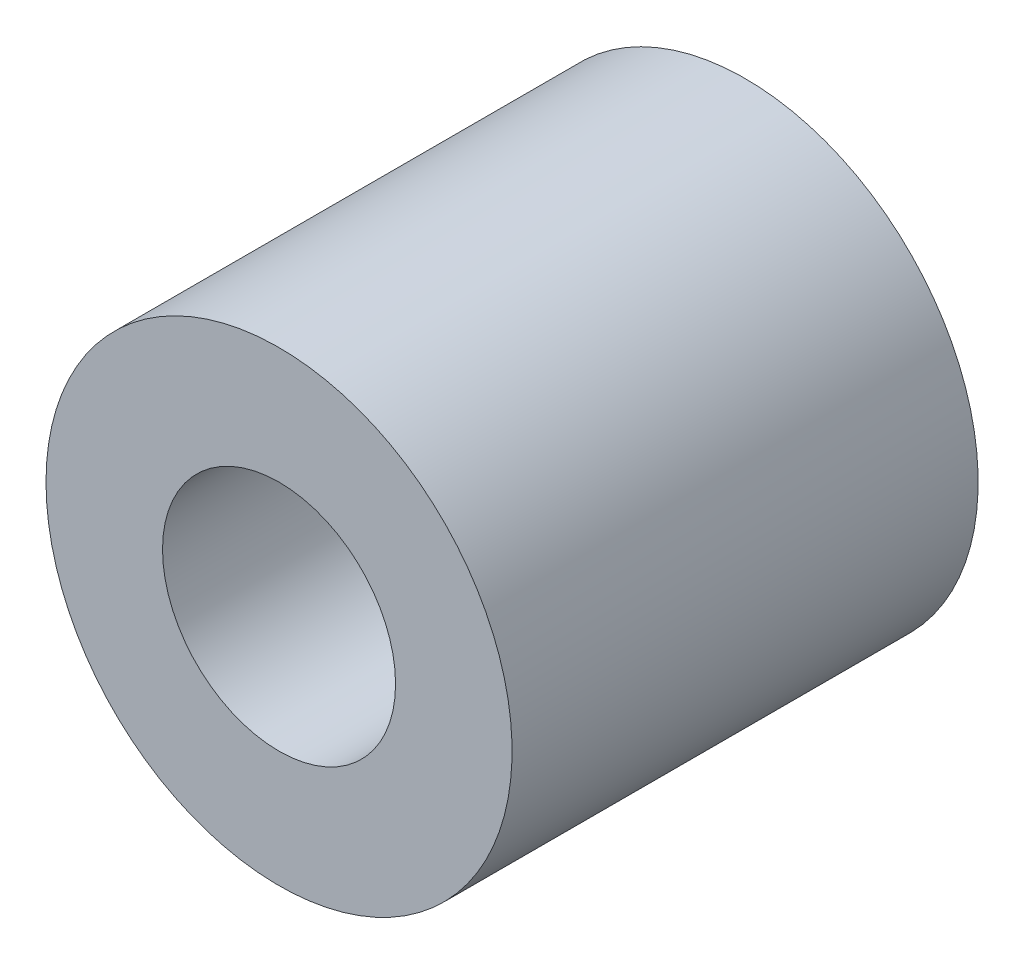
ISO-10303-21;
HEADER;
FILE_DESCRIPTION(('STEP AP214'),'2;1');
FILE_NAME('part.step','',(''),(''),'','','');
FILE_SCHEMA(('AUTOMOTIVE_DESIGN { 1 0 10303 214 1 1 1 1 }'));
ENDSEC;
DATA;
#1=APPLICATION_CONTEXT('core data for automotive mechanical design processes');
#2=APPLICATION_PROTOCOL_DEFINITION('international standard','automotive_design',2000,#1);
#3=PRODUCT_CONTEXT('',#1,'mechanical');
#4=PRODUCT('Part','Part','',(#3));
#5=PRODUCT_RELATED_PRODUCT_CATEGORY('part','',(#4));
#6=PRODUCT_DEFINITION_FORMATION('','',#4);
#7=PRODUCT_DEFINITION_CONTEXT('part definition',#1,'design');
#8=PRODUCT_DEFINITION('design','',#6,#7);
#9=PRODUCT_DEFINITION_SHAPE('','',#8);
#10=(LENGTH_UNIT() NAMED_UNIT(*) SI_UNIT(.MILLI.,.METRE.));
#11=(NAMED_UNIT(*) PLANE_ANGLE_UNIT() SI_UNIT($,.RADIAN.));
#12=(NAMED_UNIT(*) SI_UNIT($,.STERADIAN.) SOLID_ANGLE_UNIT());
#13=UNCERTAINTY_MEASURE_WITH_UNIT(LENGTH_MEASURE(1.E-05),#10,'distance_accuracy_value','');
#14=(GEOMETRIC_REPRESENTATION_CONTEXT(3) GLOBAL_UNCERTAINTY_ASSIGNED_CONTEXT((#13)) GLOBAL_UNIT_ASSIGNED_CONTEXT((#10,
#11,#12)) REPRESENTATION_CONTEXT('',''));
#15=CARTESIAN_POINT('',(0.,0.,0.));
#16=DIRECTION('',(0.,0.,1.));
#17=DIRECTION('',(1.,0.,0.));
#18=AXIS2_PLACEMENT_3D('',#15,#16,#17);
#19=CARTESIAN_POINT('',(0.,0.,9.52500000000001));
#20=DIRECTION('',(0.,0.,1.));
#21=DIRECTION('',(1.,0.,0.));
#22=AXIS2_PLACEMENT_3D('',#19,#20,#21);
#23=PLANE('',#22);
#24=CARTESIAN_POINT('',(0.,0.,9.52500000000001));
#25=DIRECTION('',(0.,0.,1.));
#26=DIRECTION('',(1.,0.,0.));
#27=AXIS2_PLACEMENT_3D('',#24,#25,#26);
#28=CIRCLE('',#27,9.525);
#29=CARTESIAN_POINT('',(-9.525,0.,9.52500000000001));
#30=VERTEX_POINT('',#29);
#31=EDGE_CURVE('E10',#30,#30,#28,.T.);
#32=ORIENTED_EDGE('',*,*,#31,.T.);
#33=EDGE_LOOP('',(#32));
#34=FACE_BOUND('',#33,.T.);
#35=CARTESIAN_POINT('',(0.,0.,9.52500000000001));
#36=DIRECTION('',(0.,0.,1.));
#37=DIRECTION('',(1.,0.,0.));
#38=AXIS2_PLACEMENT_3D('',#35,#36,#37);
#39=CIRCLE('',#38,4.7625);
#40=CARTESIAN_POINT('',(-4.7625,0.,9.52500000000001));
#41=VERTEX_POINT('',#40);
#42=EDGE_CURVE('E41',#41,#41,#39,.T.);
#43=ORIENTED_EDGE('',*,*,#42,.F.);
#44=EDGE_LOOP('',(#43));
#45=FACE_BOUND('',#44,.T.);
#46=ADVANCED_FACE('F30',(#34,#45),#23,.T.);
#47=CARTESIAN_POINT('',(0.,0.,-9.52500000000001));
#48=DIRECTION('',(0.,0.,1.));
#49=DIRECTION('',(1.,0.,0.));
#50=AXIS2_PLACEMENT_3D('',#47,#48,#49);
#51=PLANE('',#50);
#52=CARTESIAN_POINT('',(0.,0.,-9.52500000000001));
#53=DIRECTION('',(0.,0.,1.));
#54=DIRECTION('',(1.,0.,0.));
#55=AXIS2_PLACEMENT_3D('',#52,#53,#54);
#56=CIRCLE('',#55,9.525);
#57=CARTESIAN_POINT('',(-9.525,0.,-9.525));
#58=VERTEX_POINT('',#57);
#59=EDGE_CURVE('E34',#58,#58,#56,.T.);
#60=ORIENTED_EDGE('',*,*,#59,.F.);
#61=EDGE_LOOP('',(#60));
#62=FACE_BOUND('',#61,.T.);
#63=CARTESIAN_POINT('',(0.,0.,-9.52500000000001));
#64=DIRECTION('',(0.,0.,1.));
#65=DIRECTION('',(1.,0.,0.));
#66=AXIS2_PLACEMENT_3D('',#63,#64,#65);
#67=CIRCLE('',#66,4.7625);
#68=CARTESIAN_POINT('',(-4.7625,0.,-9.525));
#69=VERTEX_POINT('',#68);
#70=EDGE_CURVE('E43',#69,#69,#67,.T.);
#71=ORIENTED_EDGE('',*,*,#70,.T.);
#72=EDGE_LOOP('',(#71));
#73=FACE_BOUND('',#72,.T.);
#74=ADVANCED_FACE('F53',(#62,#73),#51,.F.);
#75=CARTESIAN_POINT('',(0.,0.,9.52500000000001));
#76=DIRECTION('',(0.,0.,-1.));
#77=DIRECTION('',(-1.,0.,0.));
#78=AXIS2_PLACEMENT_3D('',#75,#76,#77);
#79=CYLINDRICAL_SURFACE('',#78,9.525);
#80=CARTESIAN_POINT('',(-9.525,0.,9.52500000000001));
#81=CARTESIAN_POINT('',(-9.525,0.,9.32656250000001));
#82=CARTESIAN_POINT('',(-9.525,0.,9.12812500000001));
#83=CARTESIAN_POINT('',(-9.525,0.,8.73125000000001));
#84=CARTESIAN_POINT('',(-9.525,0.,8.53281250000001));
#85=CARTESIAN_POINT('',(-9.525,0.,8.13593750000001));
#86=CARTESIAN_POINT('',(-9.525,0.,7.93750000000001));
#87=CARTESIAN_POINT('',(-9.525,0.,7.54062500000001));
#88=CARTESIAN_POINT('',(-9.525,0.,7.34218750000001));
#89=CARTESIAN_POINT('',(-9.525,0.,6.94531250000001));
#90=CARTESIAN_POINT('',(-9.525,0.,6.74687500000001));
#91=CARTESIAN_POINT('',(-9.525,0.,6.35000000000001));
#92=CARTESIAN_POINT('',(-9.525,0.,6.15156250000001));
#93=CARTESIAN_POINT('',(-9.525,0.,5.75468750000001));
#94=CARTESIAN_POINT('',(-9.525,0.,5.55625));
#95=CARTESIAN_POINT('',(-9.525,0.,5.15937500000001));
#96=CARTESIAN_POINT('',(-9.525,0.,4.9609375));
#97=CARTESIAN_POINT('',(-9.525,0.,4.5640625));
#98=CARTESIAN_POINT('',(-9.525,0.,4.365625));
#99=CARTESIAN_POINT('',(-9.525,0.,3.96875));
#100=CARTESIAN_POINT('',(-9.525,0.,3.7703125));
#101=CARTESIAN_POINT('',(-9.525,0.,3.3734375));
#102=CARTESIAN_POINT('',(-9.525,0.,3.175));
#103=CARTESIAN_POINT('',(-9.525,0.,2.778125));
#104=CARTESIAN_POINT('',(-9.525,0.,2.5796875));
#105=CARTESIAN_POINT('',(-9.525,0.,2.1828125));
#106=CARTESIAN_POINT('',(-9.525,0.,1.984375));
#107=CARTESIAN_POINT('',(-9.525,0.,1.5875));
#108=CARTESIAN_POINT('',(-9.525,0.,1.3890625));
#109=CARTESIAN_POINT('',(-9.525,0.,0.992187500000002));
#110=CARTESIAN_POINT('',(-9.525,0.,0.793750000000002));
#111=CARTESIAN_POINT('',(-9.525,0.,0.396875000000002));
#112=CARTESIAN_POINT('',(-9.525,0.,0.198437500000002));
#113=CARTESIAN_POINT('',(-9.525,0.,-0.198437499999998));
#114=CARTESIAN_POINT('',(-9.525,0.,-0.396874999999998));
#115=CARTESIAN_POINT('',(-9.525,0.,-0.793749999999999));
#116=CARTESIAN_POINT('',(-9.525,0.,-0.992187499999999));
#117=CARTESIAN_POINT('',(-9.525,0.,-1.3890625));
#118=CARTESIAN_POINT('',(-9.525,0.,-1.5875));
#119=CARTESIAN_POINT('',(-9.525,0.,-1.984375));
#120=CARTESIAN_POINT('',(-9.525,0.,-2.1828125));
#121=CARTESIAN_POINT('',(-9.525,0.,-2.5796875));
#122=CARTESIAN_POINT('',(-9.525,0.,-2.778125));
#123=CARTESIAN_POINT('',(-9.525,0.,-3.175));
#124=CARTESIAN_POINT('',(-9.525,0.,-3.3734375));
#125=CARTESIAN_POINT('',(-9.525,0.,-3.7703125));
#126=CARTESIAN_POINT('',(-9.525,0.,-3.96875));
#127=CARTESIAN_POINT('',(-9.525,0.,-4.365625));
#128=CARTESIAN_POINT('',(-9.525,0.,-4.5640625));
#129=CARTESIAN_POINT('',(-9.525,0.,-4.9609375));
#130=CARTESIAN_POINT('',(-9.525,0.,-5.159375));
#131=CARTESIAN_POINT('',(-9.525,0.,-5.55625));
#132=CARTESIAN_POINT('',(-9.525,0.,-5.7546875));
#133=CARTESIAN_POINT('',(-9.525,0.,-6.1515625));
#134=CARTESIAN_POINT('',(-9.525,0.,-6.35));
#135=CARTESIAN_POINT('',(-9.525,0.,-6.746875));
#136=CARTESIAN_POINT('',(-9.525,0.,-6.9453125));
#137=CARTESIAN_POINT('',(-9.525,0.,-7.3421875));
#138=CARTESIAN_POINT('',(-9.525,0.,-7.540625));
#139=CARTESIAN_POINT('',(-9.525,0.,-7.9375));
#140=CARTESIAN_POINT('',(-9.525,0.,-8.1359375));
#141=CARTESIAN_POINT('',(-9.525,0.,-8.5328125));
#142=CARTESIAN_POINT('',(-9.525,0.,-8.73125));
#143=CARTESIAN_POINT('',(-9.525,0.,-9.128125));
#144=CARTESIAN_POINT('',(-9.525,0.,-9.3265625));
#145=CARTESIAN_POINT('',(-9.525,0.,-9.525));
#146=B_SPLINE_CURVE_WITH_KNOTS('',3,(#80,#81,#82,#83,#84,#85,#86,#87,#88,#89,#90,#91,#92,#93,
#94,#95,#96,#97,#98,#99,#100,#101,#102,#103,#104,#105,#106,#107,#108,#109,#110,#111,#112,#113,
#114,#115,#116,#117,#118,#119,#120,#121,#122,#123,#124,#125,#126,#127,#128,#129,#130,#131,#132,
#133,#134,#135,#136,#137,#138,#139,#140,#141,#142,#143,#144,#145),.UNSPECIFIED.,.F.,.F.,(4,2,2,
2,2,2,2,2,2,2,2,2,2,2,2,2,2,2,2,2,2,2,2,2,2,2,2,2,2,2,2,2,4),(0.,0.595312499999999,1.190625,
1.7859375,2.38125,2.9765625,3.571875,4.1671875,4.7625,5.3578125,5.953125,6.5484375,7.14375,
7.7390625,8.334375,8.9296875,9.525,10.1203125,10.715625,11.3109375,11.90625,12.5015625,
13.096875,13.6921875,14.2875,14.8828125,15.478125,16.0734375,16.66875,17.2640625,17.859375,
18.4546875,19.05),.UNSPECIFIED.);
#147=EDGE_CURVE('BSEAM32',#30,#58,#146,.T.);
#148=ORIENTED_EDGE('',*,*,#31,.F.);
#149=ORIENTED_EDGE('',*,*,#59,.T.);
#150=ORIENTED_EDGE('',*,*,#147,.T.);
#151=ORIENTED_EDGE('',*,*,#147,.F.);
#152=EDGE_LOOP('',(#148,#150,#149,#151));
#153=FACE_BOUND('',#152,.T.);
#154=ADVANCED_FACE('F32',(#153),#79,.T.);
#155=CARTESIAN_POINT('',(0.,0.,9.52500000000001));
#156=DIRECTION('',(0.,0.,-1.));
#157=DIRECTION('',(-1.,0.,0.));
#158=AXIS2_PLACEMENT_3D('',#155,#156,#157);
#159=CYLINDRICAL_SURFACE('',#158,4.7625);
#160=CARTESIAN_POINT('',(-4.7625,0.,9.52500000000001));
#161=CARTESIAN_POINT('',(-4.7625,0.,9.32656250000001));
#162=CARTESIAN_POINT('',(-4.7625,0.,9.12812500000001));
#163=CARTESIAN_POINT('',(-4.7625,0.,8.73125000000001));
#164=CARTESIAN_POINT('',(-4.7625,0.,8.53281250000001));
#165=CARTESIAN_POINT('',(-4.7625,0.,8.13593750000001));
#166=CARTESIAN_POINT('',(-4.7625,0.,7.93750000000001));
#167=CARTESIAN_POINT('',(-4.7625,0.,7.54062500000001));
#168=CARTESIAN_POINT('',(-4.7625,0.,7.34218750000001));
#169=CARTESIAN_POINT('',(-4.7625,0.,6.94531250000001));
#170=CARTESIAN_POINT('',(-4.7625,0.,6.74687500000001));
#171=CARTESIAN_POINT('',(-4.7625,0.,6.35000000000001));
#172=CARTESIAN_POINT('',(-4.7625,0.,6.15156250000001));
#173=CARTESIAN_POINT('',(-4.7625,0.,5.75468750000001));
#174=CARTESIAN_POINT('',(-4.7625,0.,5.55625));
#175=CARTESIAN_POINT('',(-4.7625,0.,5.15937500000001));
#176=CARTESIAN_POINT('',(-4.7625,0.,4.9609375));
#177=CARTESIAN_POINT('',(-4.7625,0.,4.5640625));
#178=CARTESIAN_POINT('',(-4.7625,0.,4.365625));
#179=CARTESIAN_POINT('',(-4.7625,0.,3.96875));
#180=CARTESIAN_POINT('',(-4.7625,0.,3.7703125));
#181=CARTESIAN_POINT('',(-4.7625,0.,3.3734375));
#182=CARTESIAN_POINT('',(-4.7625,0.,3.175));
#183=CARTESIAN_POINT('',(-4.7625,0.,2.778125));
#184=CARTESIAN_POINT('',(-4.7625,0.,2.5796875));
#185=CARTESIAN_POINT('',(-4.7625,0.,2.1828125));
#186=CARTESIAN_POINT('',(-4.7625,0.,1.984375));
#187=CARTESIAN_POINT('',(-4.7625,0.,1.5875));
#188=CARTESIAN_POINT('',(-4.7625,0.,1.3890625));
#189=CARTESIAN_POINT('',(-4.7625,0.,0.992187500000004));
#190=CARTESIAN_POINT('',(-4.7625,0.,0.793750000000004));
#191=CARTESIAN_POINT('',(-4.7625,0.,0.396875000000004));
#192=CARTESIAN_POINT('',(-4.7625,0.,0.198437500000004));
#193=CARTESIAN_POINT('',(-4.7625,0.,-0.198437499999997));
#194=CARTESIAN_POINT('',(-4.7625,0.,-0.396874999999997));
#195=CARTESIAN_POINT('',(-4.7625,0.,-0.793749999999997));
#196=CARTESIAN_POINT('',(-4.7625,0.,-0.992187499999997));
#197=CARTESIAN_POINT('',(-4.7625,0.,-1.3890625));
#198=CARTESIAN_POINT('',(-4.7625,0.,-1.5875));
#199=CARTESIAN_POINT('',(-4.7625,0.,-1.984375));
#200=CARTESIAN_POINT('',(-4.7625,0.,-2.1828125));
#201=CARTESIAN_POINT('',(-4.7625,0.,-2.5796875));
#202=CARTESIAN_POINT('',(-4.7625,0.,-2.778125));
#203=CARTESIAN_POINT('',(-4.7625,0.,-3.175));
#204=CARTESIAN_POINT('',(-4.7625,0.,-3.3734375));
#205=CARTESIAN_POINT('',(-4.7625,0.,-3.7703125));
#206=CARTESIAN_POINT('',(-4.7625,0.,-3.96875));
#207=CARTESIAN_POINT('',(-4.7625,0.,-4.365625));
#208=CARTESIAN_POINT('',(-4.7625,0.,-4.5640625));
#209=CARTESIAN_POINT('',(-4.7625,0.,-4.9609375));
#210=CARTESIAN_POINT('',(-4.7625,0.,-5.159375));
#211=CARTESIAN_POINT('',(-4.7625,0.,-5.55625));
#212=CARTESIAN_POINT('',(-4.7625,0.,-5.7546875));
#213=CARTESIAN_POINT('',(-4.7625,0.,-6.1515625));
#214=CARTESIAN_POINT('',(-4.7625,0.,-6.35));
#215=CARTESIAN_POINT('',(-4.7625,0.,-6.746875));
#216=CARTESIAN_POINT('',(-4.7625,0.,-6.9453125));
#217=CARTESIAN_POINT('',(-4.7625,0.,-7.3421875));
#218=CARTESIAN_POINT('',(-4.7625,0.,-7.540625));
#219=CARTESIAN_POINT('',(-4.7625,0.,-7.9375));
#220=CARTESIAN_POINT('',(-4.7625,0.,-8.1359375));
#221=CARTESIAN_POINT('',(-4.7625,0.,-8.5328125));
#222=CARTESIAN_POINT('',(-4.7625,0.,-8.73125));
#223=CARTESIAN_POINT('',(-4.7625,0.,-9.128125));
#224=CARTESIAN_POINT('',(-4.7625,0.,-9.3265625));
#225=CARTESIAN_POINT('',(-4.7625,0.,-9.525));
#226=B_SPLINE_CURVE_WITH_KNOTS('',3,(#160,#161,#162,#163,#164,#165,#166,#167,#168,#169,#170,
#171,#172,#173,#174,#175,#176,#177,#178,#179,#180,#181,#182,#183,#184,#185,#186,#187,#188,#189,
#190,#191,#192,#193,#194,#195,#196,#197,#198,#199,#200,#201,#202,#203,#204,#205,#206,#207,#208,
#209,#210,#211,#212,#213,#214,#215,#216,#217,#218,#219,#220,#221,#222,#223,#224,#225),
.UNSPECIFIED.,.F.,.F.,(4,2,2,2,2,2,2,2,2,2,2,2,2,2,2,2,2,2,2,2,2,2,2,2,2,2,2,2,2,2,2,2,4),(0.,
0.5953125,1.190625,1.7859375,2.38125,2.9765625,3.571875,4.1671875,4.7625,5.3578125,5.953125,
6.5484375,7.14375,7.7390625,8.334375,8.9296875,9.525,10.1203125,10.715625,11.3109375,11.90625,
12.5015625,13.096875,13.6921875,14.2875,14.8828125,15.478125,16.0734375,16.66875,17.2640625,
17.859375,18.4546875,19.05),.UNSPECIFIED.);
#227=EDGE_CURVE('BSEAM49',#41,#69,#226,.T.);
#228=ORIENTED_EDGE('',*,*,#42,.T.);
#229=ORIENTED_EDGE('',*,*,#70,.F.);
#230=ORIENTED_EDGE('',*,*,#227,.T.);
#231=ORIENTED_EDGE('',*,*,#227,.F.);
#232=EDGE_LOOP('',(#228,#230,#229,#231));
#233=FACE_BOUND('',#232,.T.);
#234=ADVANCED_FACE('F49',(#233),#159,.F.);
#235=CLOSED_SHELL('',(#46,#74,#154,#234));
#236=MANIFOLD_SOLID_BREP('B2',#235);
#237=ADVANCED_BREP_SHAPE_REPRESENTATION('',(#18,#236),#14);
#238=SHAPE_DEFINITION_REPRESENTATION(#9,#237);
ENDSEC;
END-ISO-10303-21;
